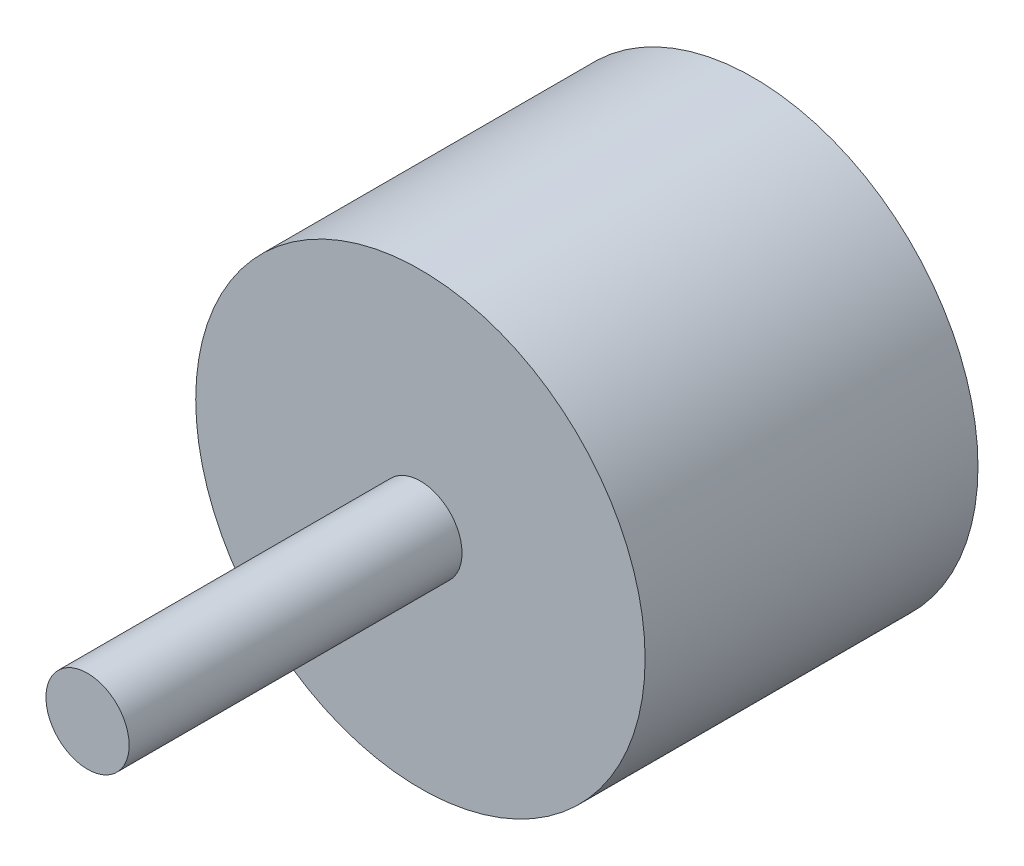
ISO-10303-21;
HEADER;
FILE_DESCRIPTION(('STEP AP214'),'2;1');
FILE_NAME('part.step','',(''),(''),'','','');
FILE_SCHEMA(('AUTOMOTIVE_DESIGN { 1 0 10303 214 1 1 1 1 }'));
ENDSEC;
DATA;
#1=APPLICATION_CONTEXT('core data for automotive mechanical design processes');
#2=APPLICATION_PROTOCOL_DEFINITION('international standard','automotive_design',2000,#1);
#3=PRODUCT_CONTEXT('',#1,'mechanical');
#4=PRODUCT('Part','Part','',(#3));
#5=PRODUCT_RELATED_PRODUCT_CATEGORY('part','',(#4));
#6=PRODUCT_DEFINITION_FORMATION('','',#4);
#7=PRODUCT_DEFINITION_CONTEXT('part definition',#1,'design');
#8=PRODUCT_DEFINITION('design','',#6,#7);
#9=PRODUCT_DEFINITION_SHAPE('','',#8);
#10=(LENGTH_UNIT() NAMED_UNIT(*) SI_UNIT(.MILLI.,.METRE.));
#11=(NAMED_UNIT(*) PLANE_ANGLE_UNIT() SI_UNIT($,.RADIAN.));
#12=(NAMED_UNIT(*) SI_UNIT($,.STERADIAN.) SOLID_ANGLE_UNIT());
#13=UNCERTAINTY_MEASURE_WITH_UNIT(LENGTH_MEASURE(1.E-05),#10,'distance_accuracy_value','');
#14=(GEOMETRIC_REPRESENTATION_CONTEXT(3) GLOBAL_UNCERTAINTY_ASSIGNED_CONTEXT((#13)) GLOBAL_UNIT_ASSIGNED_CONTEXT((#10,
#11,#12)) REPRESENTATION_CONTEXT('',''));
#15=CARTESIAN_POINT('',(0.,0.,0.));
#16=DIRECTION('',(0.,0.,1.));
#17=DIRECTION('',(1.,0.,0.));
#18=AXIS2_PLACEMENT_3D('',#15,#16,#17);
#19=CARTESIAN_POINT('',(0.,0.,40.));
#20=DIRECTION('',(0.,0.,-1.));
#21=DIRECTION('',(-1.,0.,0.));
#22=AXIS2_PLACEMENT_3D('',#19,#20,#21);
#23=CYLINDRICAL_SURFACE('',#22,27.);
#24=CARTESIAN_POINT('',(0.,0.,40.));
#25=DIRECTION('',(0.,0.,1.));
#26=DIRECTION('',(1.,0.,0.));
#27=AXIS2_PLACEMENT_3D('',#24,#25,#26);
#28=CIRCLE('',#27,27.);
#29=CARTESIAN_POINT('',(27.,0.,40.));
#30=VERTEX_POINT('',#29);
#31=EDGE_CURVE('E42',#30,#30,#28,.T.);
#32=ORIENTED_EDGE('',*,*,#31,.F.);
#33=EDGE_LOOP('',(#32));
#34=FACE_BOUND('',#33,.T.);
#35=CARTESIAN_POINT('',(0.,0.,0.));
#36=DIRECTION('',(0.,0.,1.));
#37=DIRECTION('',(1.,0.,0.));
#38=AXIS2_PLACEMENT_3D('',#35,#36,#37);
#39=CIRCLE('',#38,27.);
#40=CARTESIAN_POINT('',(27.,0.,0.));
#41=VERTEX_POINT('',#40);
#42=EDGE_CURVE('E38',#41,#41,#39,.T.);
#43=ORIENTED_EDGE('',*,*,#42,.T.);
#44=EDGE_LOOP('',(#43));
#45=FACE_BOUND('',#44,.T.);
#46=ADVANCED_FACE('F35',(#34,#45),#23,.T.);
#47=CARTESIAN_POINT('',(0.,0.,40.));
#48=DIRECTION('',(0.,0.,1.));
#49=DIRECTION('',(1.,0.,0.));
#50=AXIS2_PLACEMENT_3D('',#47,#48,#49);
#51=PLANE('',#50);
#52=CARTESIAN_POINT('',(0.,0.,40.));
#53=DIRECTION('',(0.,0.,1.));
#54=DIRECTION('',(1.,0.,0.));
#55=AXIS2_PLACEMENT_3D('',#52,#53,#54);
#56=CIRCLE('',#55,5.);
#57=CARTESIAN_POINT('',(5.,0.,40.));
#58=VERTEX_POINT('',#57);
#59=EDGE_CURVE('E10',#58,#58,#56,.T.);
#60=ORIENTED_EDGE('',*,*,#59,.F.);
#61=EDGE_LOOP('',(#60));
#62=FACE_BOUND('',#61,.T.);
#63=ORIENTED_EDGE('',*,*,#31,.T.);
#64=EDGE_LOOP('',(#63));
#65=FACE_BOUND('',#64,.T.);
#66=ADVANCED_FACE('F59',(#62,#65),#51,.T.);
#67=CARTESIAN_POINT('',(0.,0.,0.));
#68=DIRECTION('',(0.,0.,1.));
#69=DIRECTION('',(1.,0.,0.));
#70=AXIS2_PLACEMENT_3D('',#67,#68,#69);
#71=PLANE('',#70);
#72=ORIENTED_EDGE('',*,*,#42,.F.);
#73=EDGE_LOOP('',(#72));
#74=FACE_BOUND('',#73,.T.);
#75=ADVANCED_FACE('F56',(#74),#71,.F.);
#76=CARTESIAN_POINT('',(0.,0.,80.));
#77=DIRECTION('',(0.,0.,-1.));
#78=DIRECTION('',(-1.,0.,0.));
#79=AXIS2_PLACEMENT_3D('',#76,#77,#78);
#80=CYLINDRICAL_SURFACE('',#79,5.);
#81=CARTESIAN_POINT('',(0.,0.,80.));
#82=DIRECTION('',(0.,0.,1.));
#83=DIRECTION('',(1.,0.,0.));
#84=AXIS2_PLACEMENT_3D('',#81,#82,#83);
#85=CIRCLE('',#84,5.);
#86=CARTESIAN_POINT('',(5.,0.,80.));
#87=VERTEX_POINT('',#86);
#88=EDGE_CURVE('E48',#87,#87,#85,.T.);
#89=ORIENTED_EDGE('',*,*,#88,.F.);
#90=EDGE_LOOP('',(#89));
#91=FACE_BOUND('',#90,.T.);
#92=ORIENTED_EDGE('',*,*,#59,.T.);
#93=EDGE_LOOP('',(#92));
#94=FACE_BOUND('',#93,.T.);
#95=ADVANCED_FACE('F58',(#91,#94),#80,.T.);
#96=CARTESIAN_POINT('',(0.,0.,80.));
#97=DIRECTION('',(0.,0.,1.));
#98=DIRECTION('',(1.,0.,0.));
#99=AXIS2_PLACEMENT_3D('',#96,#97,#98);
#100=PLANE('',#99);
#101=ORIENTED_EDGE('',*,*,#88,.T.);
#102=EDGE_LOOP('',(#101));
#103=FACE_BOUND('',#102,.T.);
#104=ADVANCED_FACE('F64',(#103),#100,.T.);
#105=CLOSED_SHELL('',(#46,#66,#75,#95,#104));
#106=MANIFOLD_SOLID_BREP('B2',#105);
#107=ADVANCED_BREP_SHAPE_REPRESENTATION('',(#18,#106),#14);
#108=SHAPE_DEFINITION_REPRESENTATION(#9,#107);
ENDSEC;
END-ISO-10303-21;
